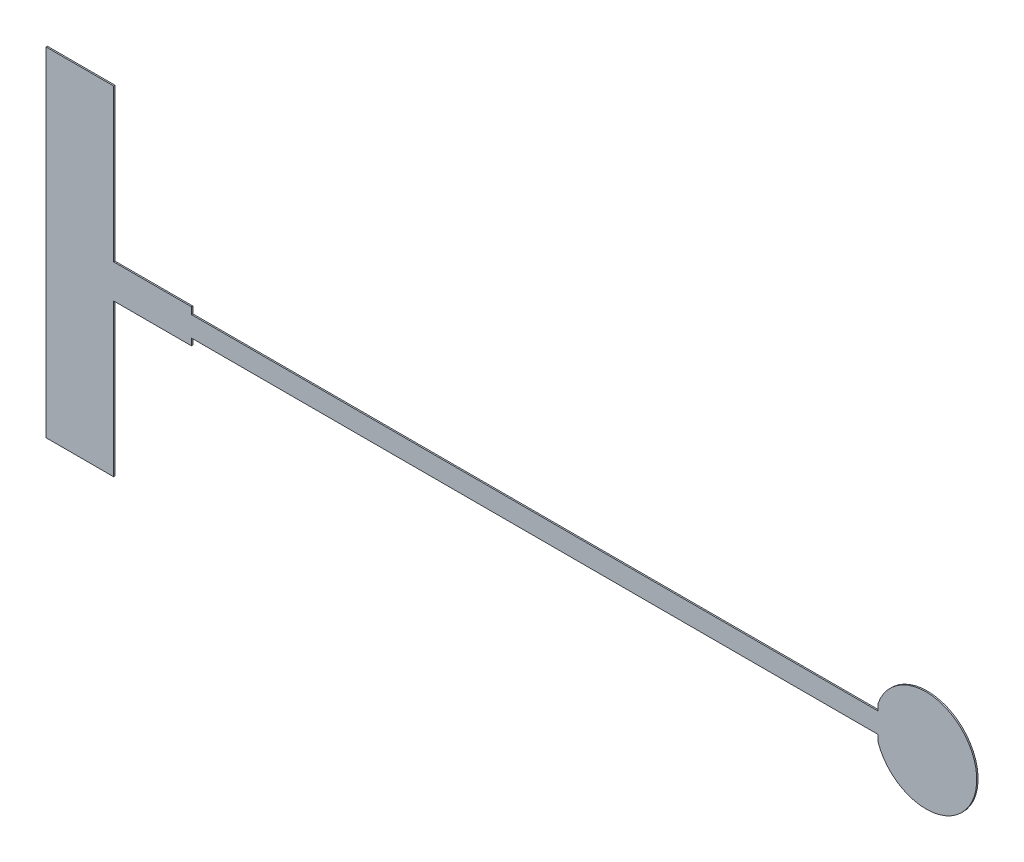
ISO-10303-21;
HEADER;
FILE_DESCRIPTION(('STEP AP214'),'2;1');
FILE_NAME('part.step','',(''),(''),'','','');
FILE_SCHEMA(('AUTOMOTIVE_DESIGN { 1 0 10303 214 1 1 1 1 }'));
ENDSEC;
DATA;
#1=APPLICATION_CONTEXT('core data for automotive mechanical design processes');
#2=APPLICATION_PROTOCOL_DEFINITION('international standard','automotive_design',2000,#1);
#3=PRODUCT_CONTEXT('',#1,'mechanical');
#4=PRODUCT('Part','Part','',(#3));
#5=PRODUCT_RELATED_PRODUCT_CATEGORY('part','',(#4));
#6=PRODUCT_DEFINITION_FORMATION('','',#4);
#7=PRODUCT_DEFINITION_CONTEXT('part definition',#1,'design');
#8=PRODUCT_DEFINITION('design','',#6,#7);
#9=PRODUCT_DEFINITION_SHAPE('','',#8);
#10=(LENGTH_UNIT() NAMED_UNIT(*) SI_UNIT(.MILLI.,.METRE.));
#11=(NAMED_UNIT(*) PLANE_ANGLE_UNIT() SI_UNIT($,.RADIAN.));
#12=(NAMED_UNIT(*) SI_UNIT($,.STERADIAN.) SOLID_ANGLE_UNIT());
#13=UNCERTAINTY_MEASURE_WITH_UNIT(LENGTH_MEASURE(1.E-05),#10,'distance_accuracy_value','');
#14=(GEOMETRIC_REPRESENTATION_CONTEXT(3) GLOBAL_UNCERTAINTY_ASSIGNED_CONTEXT((#13)) GLOBAL_UNIT_ASSIGNED_CONTEXT((#10,
#11,#12)) REPRESENTATION_CONTEXT('',''));
#15=CARTESIAN_POINT('',(0.,0.,0.));
#16=DIRECTION('',(0.,0.,1.));
#17=DIRECTION('',(1.,0.,0.));
#18=AXIS2_PLACEMENT_3D('',#15,#16,#17);
#19=CARTESIAN_POINT('',(1000.,-250.,-20.));
#20=DIRECTION('',(0.,-1.,0.));
#21=DIRECTION('',(1.,0.,0.));
#22=AXIS2_PLACEMENT_3D('',#19,#20,#21);
#23=PLANE('',#22);
#24=DIRECTION('',(1.,0.,0.));
#25=VECTOR('',#24,1.);
#26=CARTESIAN_POINT('',(1000.,-250.,-20.));
#27=LINE('',#26,#25);
#28=CARTESIAN_POINT('',(0.,-250.,-20.));
#29=VERTEX_POINT('',#28);
#30=CARTESIAN_POINT('',(1150.,-250.000000000001,-20.));
#31=VERTEX_POINT('',#30);
#32=EDGE_CURVE('E161',#29,#31,#27,.T.);
#33=ORIENTED_EDGE('',*,*,#32,.T.);
#34=DIRECTION('',(0.,0.,1.));
#35=VECTOR('',#34,1.);
#36=CARTESIAN_POINT('',(1150.,-250.000000000001,-20.));
#37=LINE('',#36,#35);
#38=CARTESIAN_POINT('',(1150.,-250.000000000001,0.));
#39=VERTEX_POINT('',#38);
#40=EDGE_CURVE('E142',#31,#39,#37,.T.);
#41=ORIENTED_EDGE('',*,*,#40,.T.);
#42=DIRECTION('',(1.,0.,0.));
#43=VECTOR('',#42,1.);
#44=CARTESIAN_POINT('',(1000.,-250.,0.));
#45=LINE('',#44,#43);
#46=CARTESIAN_POINT('',(0.,-250.,0.));
#47=VERTEX_POINT('',#46);
#48=EDGE_CURVE('E200',#47,#39,#45,.T.);
#49=ORIENTED_EDGE('',*,*,#48,.F.);
#50=DIRECTION('',(0.,0.,1.));
#51=VECTOR('',#50,1.);
#52=CARTESIAN_POINT('',(0.,-250.,-20.));
#53=LINE('',#52,#51);
#54=EDGE_CURVE('E169',#29,#47,#53,.T.);
#55=ORIENTED_EDGE('',*,*,#54,.F.);
#56=EDGE_LOOP('',(#33,#41,#49,#55));
#57=FACE_BOUND('',#56,.T.);
#58=ADVANCED_FACE('F42',(#57),#23,.T.);
#59=CARTESIAN_POINT('',(12000.,2.44249065417534E-12,-20.));
#60=DIRECTION('',(0.,0.,1.));
#61=DIRECTION('',(1.,0.,0.));
#62=AXIS2_PLACEMENT_3D('',#59,#60,#61);
#63=PLANE('',#62);
#64=DIRECTION('',(0.,1.,0.));
#65=VECTOR('',#64,1.);
#66=CARTESIAN_POINT('',(1150.,-250.000000000001,-20.));
#67=LINE('',#66,#65);
#68=CARTESIAN_POINT('',(1150.,-150.000000000001,-20.));
#69=VERTEX_POINT('',#68);
#70=EDGE_CURVE('E146',#31,#69,#67,.T.);
#71=ORIENTED_EDGE('',*,*,#70,.F.);
#72=ORIENTED_EDGE('',*,*,#32,.F.);
#73=DIRECTION('',(0.,-1.,0.));
#74=VECTOR('',#73,1.);
#75=CARTESIAN_POINT('',(0.,-2500.,-20.));
#76=LINE('',#75,#74);
#77=CARTESIAN_POINT('',(0.,-2500.,-20.));
#78=VERTEX_POINT('',#77);
#79=EDGE_CURVE('E184',#29,#78,#76,.T.);
#80=ORIENTED_EDGE('',*,*,#79,.T.);
#81=DIRECTION('',(1.,0.,0.));
#82=VECTOR('',#81,1.);
#83=CARTESIAN_POINT('',(-1000.,-2500.,-20.));
#84=LINE('',#83,#82);
#85=CARTESIAN_POINT('',(-1000.,-2500.,-20.));
#86=VERTEX_POINT('',#85);
#87=EDGE_CURVE('E196',#86,#78,#84,.T.);
#88=ORIENTED_EDGE('',*,*,#87,.F.);
#89=DIRECTION('',(0.,-1.,0.));
#90=VECTOR('',#89,1.);
#91=CARTESIAN_POINT('',(-1000.,2500.,-20.));
#92=LINE('',#91,#90);
#93=CARTESIAN_POINT('',(-1000.,2500.,-20.));
#94=VERTEX_POINT('',#93);
#95=EDGE_CURVE('E192',#94,#86,#92,.T.);
#96=ORIENTED_EDGE('',*,*,#95,.F.);
#97=DIRECTION('',(-1.,0.,0.));
#98=VECTOR('',#97,1.);
#99=CARTESIAN_POINT('',(-1000.,2500.,-20.));
#100=LINE('',#99,#98);
#101=CARTESIAN_POINT('',(-4.44089209850063E-13,2500.,-20.));
#102=VERTEX_POINT('',#101);
#103=EDGE_CURVE('E189',#102,#94,#100,.T.);
#104=ORIENTED_EDGE('',*,*,#103,.F.);
#105=DIRECTION('',(0.,-1.,0.));
#106=VECTOR('',#105,1.);
#107=CARTESIAN_POINT('',(-4.44089209850063E-13,2500.,-20.));
#108=LINE('',#107,#106);
#109=CARTESIAN_POINT('',(-2.22044604925031E-13,250.,-20.));
#110=VERTEX_POINT('',#109);
#111=EDGE_CURVE('E245',#102,#110,#108,.T.);
#112=ORIENTED_EDGE('',*,*,#111,.T.);
#113=DIRECTION('',(-1.,0.,0.));
#114=VECTOR('',#113,1.);
#115=CARTESIAN_POINT('',(1000.,250.,-20.));
#116=LINE('',#115,#114);
#117=CARTESIAN_POINT('',(1150.,250.000000000001,-20.));
#118=VERTEX_POINT('',#117);
#119=EDGE_CURVE('E178',#118,#110,#116,.T.);
#120=ORIENTED_EDGE('',*,*,#119,.F.);
#121=DIRECTION('',(0.,-1.,0.));
#122=VECTOR('',#121,1.);
#123=CARTESIAN_POINT('',(1150.,250.000000000001,-20.));
#124=LINE('',#123,#122);
#125=CARTESIAN_POINT('',(1150.,150.000000000001,-20.));
#126=VERTEX_POINT('',#125);
#127=EDGE_CURVE('E267',#118,#126,#124,.T.);
#128=ORIENTED_EDGE('',*,*,#127,.T.);
#129=DIRECTION('',(1.,0.,0.));
#130=VECTOR('',#129,1.);
#131=CARTESIAN_POINT('',(1150.,150.000000000001,-20.));
#132=LINE('',#131,#130);
#133=CARTESIAN_POINT('',(11292.8932188135,150.000000000001,-20.));
#134=VERTEX_POINT('',#133);
#135=EDGE_CURVE('E271',#126,#134,#132,.T.);
#136=ORIENTED_EDGE('',*,*,#135,.T.);
#137=DIRECTION('',(0.,1.,0.));
#138=VECTOR('',#137,1.);
#139=CARTESIAN_POINT('',(11292.8932188135,250.000000000001,-20.));
#140=LINE('',#139,#138);
#141=CARTESIAN_POINT('',(11292.8932188135,250.000000000001,-20.));
#142=VERTEX_POINT('',#141);
#143=EDGE_CURVE('E275',#134,#142,#140,.T.);
#144=ORIENTED_EDGE('',*,*,#143,.T.);
#145=CARTESIAN_POINT('',(12000.,2.44249065417534E-12,-20.));
#146=DIRECTION('',(0.,0.,1.));
#147=DIRECTION('',(1.,0.,0.));
#148=AXIS2_PLACEMENT_3D('',#145,#146,#147);
#149=CIRCLE('',#148,749.999999999999);
#150=CARTESIAN_POINT('',(11292.8932188135,-250.,-20.));
#151=VERTEX_POINT('',#150);
#152=EDGE_CURVE('E172',#151,#142,#149,.T.);
#153=ORIENTED_EDGE('',*,*,#152,.F.);
#154=DIRECTION('',(0.,-1.,0.));
#155=VECTOR('',#154,1.);
#156=CARTESIAN_POINT('',(11292.8932188135,-250.000000000001,-20.));
#157=LINE('',#156,#155);
#158=CARTESIAN_POINT('',(11292.8932188135,-150.000000000001,-20.));
#159=VERTEX_POINT('',#158);
#160=EDGE_CURVE('E165',#159,#151,#157,.T.);
#161=ORIENTED_EDGE('',*,*,#160,.F.);
#162=DIRECTION('',(1.,0.,0.));
#163=VECTOR('',#162,1.);
#164=CARTESIAN_POINT('',(1150.,-150.000000000001,-20.));
#165=LINE('',#164,#163);
#166=EDGE_CURVE('E155',#69,#159,#165,.T.);
#167=ORIENTED_EDGE('',*,*,#166,.F.);
#168=EDGE_LOOP('',(#71,#72,#80,#88,#96,#104,#112,#120,#128,#136,#144,#153,#161,#167));
#169=FACE_BOUND('',#168,.T.);
#170=ADVANCED_FACE('F159',(#169),#63,.F.);
#171=CARTESIAN_POINT('',(12000.,2.44249065417534E-12,0.));
#172=DIRECTION('',(0.,0.,1.));
#173=DIRECTION('',(1.,0.,0.));
#174=AXIS2_PLACEMENT_3D('',#171,#172,#173);
#175=PLANE('',#174);
#176=ORIENTED_EDGE('',*,*,#48,.T.);
#177=DIRECTION('',(0.,1.,0.));
#178=VECTOR('',#177,1.);
#179=CARTESIAN_POINT('',(1150.,-250.000000000001,0.));
#180=LINE('',#179,#178);
#181=CARTESIAN_POINT('',(1150.,-150.000000000001,0.));
#182=VERTEX_POINT('',#181);
#183=EDGE_CURVE('E149',#39,#182,#180,.T.);
#184=ORIENTED_EDGE('',*,*,#183,.T.);
#185=DIRECTION('',(1.,0.,0.));
#186=VECTOR('',#185,1.);
#187=CARTESIAN_POINT('',(1150.,-150.000000000001,0.));
#188=LINE('',#187,#186);
#189=CARTESIAN_POINT('',(11292.8932188135,-150.000000000001,0.));
#190=VERTEX_POINT('',#189);
#191=EDGE_CURVE('E166',#182,#190,#188,.T.);
#192=ORIENTED_EDGE('',*,*,#191,.T.);
#193=DIRECTION('',(0.,-1.,0.));
#194=VECTOR('',#193,1.);
#195=CARTESIAN_POINT('',(11292.8932188135,-250.000000000001,0.));
#196=LINE('',#195,#194);
#197=CARTESIAN_POINT('',(11292.8932188135,-250.000000000001,0.));
#198=VERTEX_POINT('',#197);
#199=EDGE_CURVE('E252',#190,#198,#196,.T.);
#200=ORIENTED_EDGE('',*,*,#199,.T.);
#201=CARTESIAN_POINT('',(12000.,2.44249065417534E-12,0.));
#202=DIRECTION('',(0.,0.,1.));
#203=DIRECTION('',(1.,0.,0.));
#204=AXIS2_PLACEMENT_3D('',#201,#202,#203);
#205=CIRCLE('',#204,749.999999999999);
#206=CARTESIAN_POINT('',(11292.8932188135,250.000000000001,0.));
#207=VERTEX_POINT('',#206);
#208=EDGE_CURVE('E203',#198,#207,#205,.T.);
#209=ORIENTED_EDGE('',*,*,#208,.T.);
#210=DIRECTION('',(0.,1.,0.));
#211=VECTOR('',#210,1.);
#212=CARTESIAN_POINT('',(11292.8932188135,250.000000000001,0.));
#213=LINE('',#212,#211);
#214=CARTESIAN_POINT('',(11292.8932188135,150.000000000001,0.));
#215=VERTEX_POINT('',#214);
#216=EDGE_CURVE('E57',#215,#207,#213,.T.);
#217=ORIENTED_EDGE('',*,*,#216,.F.);
#218=DIRECTION('',(1.,0.,0.));
#219=VECTOR('',#218,1.);
#220=CARTESIAN_POINT('',(1150.,150.000000000001,0.));
#221=LINE('',#220,#219);
#222=CARTESIAN_POINT('',(1150.,150.000000000001,0.));
#223=VERTEX_POINT('',#222);
#224=EDGE_CURVE('E283',#223,#215,#221,.T.);
#225=ORIENTED_EDGE('',*,*,#224,.F.);
#226=DIRECTION('',(0.,-1.,0.));
#227=VECTOR('',#226,1.);
#228=CARTESIAN_POINT('',(1150.,250.000000000001,0.));
#229=LINE('',#228,#227);
#230=CARTESIAN_POINT('',(1150.,250.000000000001,0.));
#231=VERTEX_POINT('',#230);
#232=EDGE_CURVE('E264',#231,#223,#229,.T.);
#233=ORIENTED_EDGE('',*,*,#232,.F.);
#234=DIRECTION('',(-1.,0.,0.));
#235=VECTOR('',#234,1.);
#236=CARTESIAN_POINT('',(1000.,250.,0.));
#237=LINE('',#236,#235);
#238=CARTESIAN_POINT('',(-2.22044604925031E-13,250.,0.));
#239=VERTEX_POINT('',#238);
#240=EDGE_CURVE('E208',#231,#239,#237,.T.);
#241=ORIENTED_EDGE('',*,*,#240,.T.);
#242=DIRECTION('',(0.,-1.,0.));
#243=VECTOR('',#242,1.);
#244=CARTESIAN_POINT('',(-4.44089209850063E-13,2500.,0.));
#245=LINE('',#244,#243);
#246=CARTESIAN_POINT('',(0.,2500.,0.));
#247=VERTEX_POINT('',#246);
#248=EDGE_CURVE('E242',#247,#239,#245,.T.);
#249=ORIENTED_EDGE('',*,*,#248,.F.);
#250=DIRECTION('',(-1.,0.,0.));
#251=VECTOR('',#250,1.);
#252=CARTESIAN_POINT('',(-1000.,2500.,0.));
#253=LINE('',#252,#251);
#254=CARTESIAN_POINT('',(-1000.,2500.,0.));
#255=VERTEX_POINT('',#254);
#256=EDGE_CURVE('E211',#247,#255,#253,.T.);
#257=ORIENTED_EDGE('',*,*,#256,.T.);
#258=DIRECTION('',(0.,-1.,0.));
#259=VECTOR('',#258,1.);
#260=CARTESIAN_POINT('',(-1000.,2500.,0.));
#261=LINE('',#260,#259);
#262=CARTESIAN_POINT('',(-1000.,-2500.,0.));
#263=VERTEX_POINT('',#262);
#264=EDGE_CURVE('E181',#255,#263,#261,.T.);
#265=ORIENTED_EDGE('',*,*,#264,.T.);
#266=DIRECTION('',(1.,0.,0.));
#267=VECTOR('',#266,1.);
#268=CARTESIAN_POINT('',(-1000.,-2500.,0.));
#269=LINE('',#268,#267);
#270=CARTESIAN_POINT('',(0.,-2500.,0.));
#271=VERTEX_POINT('',#270);
#272=EDGE_CURVE('E173',#263,#271,#269,.T.);
#273=ORIENTED_EDGE('',*,*,#272,.T.);
#274=DIRECTION('',(0.,-1.,0.));
#275=VECTOR('',#274,1.);
#276=CARTESIAN_POINT('',(0.,-2500.,0.));
#277=LINE('',#276,#275);
#278=EDGE_CURVE('E240',#47,#271,#277,.T.);
#279=ORIENTED_EDGE('',*,*,#278,.F.);
#280=EDGE_LOOP('',(#176,#184,#192,#200,#209,#217,#225,#233,#241,#249,#257,#265,#273,#279));
#281=FACE_BOUND('',#280,.T.);
#282=ADVANCED_FACE('F219',(#281),#175,.T.);
#283=CARTESIAN_POINT('',(-1000.,-2500.,-20.));
#284=DIRECTION('',(0.,-1.,0.));
#285=DIRECTION('',(0.,0.,-1.));
#286=AXIS2_PLACEMENT_3D('',#283,#284,#285);
#287=PLANE('',#286);
#288=DIRECTION('',(0.,0.,1.));
#289=VECTOR('',#288,1.);
#290=CARTESIAN_POINT('',(0.,-2500.,-20.));
#291=LINE('',#290,#289);
#292=EDGE_CURVE('E228',#78,#271,#291,.T.);
#293=ORIENTED_EDGE('',*,*,#292,.T.);
#294=ORIENTED_EDGE('',*,*,#272,.F.);
#295=DIRECTION('',(0.,0.,1.));
#296=VECTOR('',#295,1.);
#297=CARTESIAN_POINT('',(-1000.,-2500.,-20.));
#298=LINE('',#297,#296);
#299=EDGE_CURVE('E11',#86,#263,#298,.T.);
#300=ORIENTED_EDGE('',*,*,#299,.F.);
#301=ORIENTED_EDGE('',*,*,#87,.T.);
#302=EDGE_LOOP('',(#293,#294,#300,#301));
#303=FACE_BOUND('',#302,.T.);
#304=ADVANCED_FACE('F227',(#303),#287,.T.);
#305=CARTESIAN_POINT('',(-1000.,2500.,-20.));
#306=DIRECTION('',(-1.,0.,0.));
#307=DIRECTION('',(0.,-1.,0.));
#308=AXIS2_PLACEMENT_3D('',#305,#306,#307);
#309=PLANE('',#308);
#310=ORIENTED_EDGE('',*,*,#264,.F.);
#311=DIRECTION('',(0.,0.,1.));
#312=VECTOR('',#311,1.);
#313=CARTESIAN_POINT('',(-1000.,2500.,-20.));
#314=LINE('',#313,#312);
#315=EDGE_CURVE('E45',#94,#255,#314,.T.);
#316=ORIENTED_EDGE('',*,*,#315,.F.);
#317=ORIENTED_EDGE('',*,*,#95,.T.);
#318=ORIENTED_EDGE('',*,*,#299,.T.);
#319=EDGE_LOOP('',(#310,#316,#317,#318));
#320=FACE_BOUND('',#319,.T.);
#321=ADVANCED_FACE('F317',(#320),#309,.T.);
#322=CARTESIAN_POINT('',(-1000.,2500.,-20.));
#323=DIRECTION('',(0.,1.,0.));
#324=DIRECTION('',(0.,0.,1.));
#325=AXIS2_PLACEMENT_3D('',#322,#323,#324);
#326=PLANE('',#325);
#327=DIRECTION('',(0.,0.,1.));
#328=VECTOR('',#327,1.);
#329=CARTESIAN_POINT('',(-4.44089209850063E-13,2500.,-20.));
#330=LINE('',#329,#328);
#331=EDGE_CURVE('E65',#102,#247,#330,.T.);
#332=ORIENTED_EDGE('',*,*,#331,.F.);
#333=ORIENTED_EDGE('',*,*,#103,.T.);
#334=ORIENTED_EDGE('',*,*,#315,.T.);
#335=ORIENTED_EDGE('',*,*,#256,.F.);
#336=EDGE_LOOP('',(#332,#333,#334,#335));
#337=FACE_BOUND('',#336,.T.);
#338=ADVANCED_FACE('F314',(#337),#326,.T.);
#339=CARTESIAN_POINT('',(1000.,250.,-20.));
#340=DIRECTION('',(0.,1.,0.));
#341=DIRECTION('',(0.,0.,1.));
#342=AXIS2_PLACEMENT_3D('',#339,#340,#341);
#343=PLANE('',#342);
#344=DIRECTION('',(0.,0.,1.));
#345=VECTOR('',#344,1.);
#346=CARTESIAN_POINT('',(1150.,250.000000000001,-20.));
#347=LINE('',#346,#345);
#348=EDGE_CURVE('E289',#118,#231,#347,.T.);
#349=ORIENTED_EDGE('',*,*,#348,.F.);
#350=ORIENTED_EDGE('',*,*,#119,.T.);
#351=DIRECTION('',(0.,0.,1.));
#352=VECTOR('',#351,1.);
#353=CARTESIAN_POINT('',(-2.22044604925031E-13,250.,-20.));
#354=LINE('',#353,#352);
#355=EDGE_CURVE('E204',#110,#239,#354,.T.);
#356=ORIENTED_EDGE('',*,*,#355,.T.);
#357=ORIENTED_EDGE('',*,*,#240,.F.);
#358=EDGE_LOOP('',(#349,#350,#356,#357));
#359=FACE_BOUND('',#358,.T.);
#360=ADVANCED_FACE('F309',(#359),#343,.T.);
#361=CARTESIAN_POINT('',(12000.,2.44249065417534E-12,-20.));
#362=DIRECTION('',(0.,0.,1.));
#363=DIRECTION('',(1.,0.,0.));
#364=AXIS2_PLACEMENT_3D('',#361,#362,#363);
#365=CYLINDRICAL_SURFACE('',#364,749.999999999999);
#366=DIRECTION('',(0.,0.,1.));
#367=VECTOR('',#366,1.);
#368=CARTESIAN_POINT('',(11292.8932188135,250.,-20.));
#369=LINE('',#368,#367);
#370=EDGE_CURVE('E237',#207,#142,#369,.F.);
#371=ORIENTED_EDGE('',*,*,#370,.F.);
#372=ORIENTED_EDGE('',*,*,#208,.F.);
#373=DIRECTION('',(0.,0.,1.));
#374=VECTOR('',#373,1.);
#375=CARTESIAN_POINT('',(11292.8932188135,-250.,-20.));
#376=LINE('',#375,#374);
#377=EDGE_CURVE('E232',#151,#198,#376,.T.);
#378=ORIENTED_EDGE('',*,*,#377,.F.);
#379=ORIENTED_EDGE('',*,*,#152,.T.);
#380=EDGE_LOOP('',(#371,#372,#378,#379));
#381=FACE_BOUND('',#380,.T.);
#382=ADVANCED_FACE('F329',(#381),#365,.T.);
#383=CARTESIAN_POINT('',(0.,-2500.,-20.));
#384=DIRECTION('',(-1.,0.,0.));
#385=DIRECTION('',(0.,0.,1.));
#386=AXIS2_PLACEMENT_3D('',#383,#384,#385);
#387=PLANE('',#386);
#388=ORIENTED_EDGE('',*,*,#278,.T.);
#389=ORIENTED_EDGE('',*,*,#292,.F.);
#390=ORIENTED_EDGE('',*,*,#79,.F.);
#391=ORIENTED_EDGE('',*,*,#54,.T.);
#392=EDGE_LOOP('',(#388,#389,#390,#391));
#393=FACE_BOUND('',#392,.T.);
#394=ADVANCED_FACE('F248',(#393),#387,.F.);
#395=CARTESIAN_POINT('',(-4.44089209850063E-13,2500.,-20.));
#396=DIRECTION('',(-1.,0.,0.));
#397=DIRECTION('',(0.,-1.,0.));
#398=AXIS2_PLACEMENT_3D('',#395,#396,#397);
#399=PLANE('',#398);
#400=ORIENTED_EDGE('',*,*,#248,.T.);
#401=ORIENTED_EDGE('',*,*,#355,.F.);
#402=ORIENTED_EDGE('',*,*,#111,.F.);
#403=ORIENTED_EDGE('',*,*,#331,.T.);
#404=EDGE_LOOP('',(#400,#401,#402,#403));
#405=FACE_BOUND('',#404,.T.);
#406=ADVANCED_FACE('F311',(#405),#399,.F.);
#407=CARTESIAN_POINT('',(1150.,250.000000000001,-20.));
#408=DIRECTION('',(-1.,0.,0.));
#409=DIRECTION('',(0.,-1.,0.));
#410=AXIS2_PLACEMENT_3D('',#407,#408,#409);
#411=PLANE('',#410);
#412=ORIENTED_EDGE('',*,*,#232,.T.);
#413=DIRECTION('',(0.,0.,1.));
#414=VECTOR('',#413,1.);
#415=CARTESIAN_POINT('',(1150.,150.000000000001,-20.));
#416=LINE('',#415,#414);
#417=EDGE_CURVE('E279',#126,#223,#416,.T.);
#418=ORIENTED_EDGE('',*,*,#417,.F.);
#419=ORIENTED_EDGE('',*,*,#127,.F.);
#420=ORIENTED_EDGE('',*,*,#348,.T.);
#421=EDGE_LOOP('',(#412,#418,#419,#420));
#422=FACE_BOUND('',#421,.T.);
#423=ADVANCED_FACE('F320',(#422),#411,.F.);
#424=CARTESIAN_POINT('',(11292.8932188135,250.000000000001,-20.));
#425=DIRECTION('',(1.,0.,0.));
#426=DIRECTION('',(0.,0.,-1.));
#427=AXIS2_PLACEMENT_3D('',#424,#425,#426);
#428=PLANE('',#427);
#429=ORIENTED_EDGE('',*,*,#216,.T.);
#430=ORIENTED_EDGE('',*,*,#370,.T.);
#431=ORIENTED_EDGE('',*,*,#143,.F.);
#432=DIRECTION('',(0.,0.,1.));
#433=VECTOR('',#432,1.);
#434=CARTESIAN_POINT('',(11292.8932188135,150.000000000001,-20.));
#435=LINE('',#434,#433);
#436=EDGE_CURVE('E292',#134,#215,#435,.T.);
#437=ORIENTED_EDGE('',*,*,#436,.T.);
#438=EDGE_LOOP('',(#429,#430,#431,#437));
#439=FACE_BOUND('',#438,.T.);
#440=ADVANCED_FACE('F325',(#439),#428,.F.);
#441=CARTESIAN_POINT('',(1150.,150.000000000001,-20.));
#442=DIRECTION('',(0.,-1.,0.));
#443=DIRECTION('',(0.,0.,-1.));
#444=AXIS2_PLACEMENT_3D('',#441,#442,#443);
#445=PLANE('',#444);
#446=ORIENTED_EDGE('',*,*,#224,.T.);
#447=ORIENTED_EDGE('',*,*,#436,.F.);
#448=ORIENTED_EDGE('',*,*,#135,.F.);
#449=ORIENTED_EDGE('',*,*,#417,.T.);
#450=EDGE_LOOP('',(#446,#447,#448,#449));
#451=FACE_BOUND('',#450,.T.);
#452=ADVANCED_FACE('F323',(#451),#445,.F.);
#453=CARTESIAN_POINT('',(1150.,-250.000000000001,-20.));
#454=DIRECTION('',(1.,0.,0.));
#455=DIRECTION('',(0.,1.,0.));
#456=AXIS2_PLACEMENT_3D('',#453,#454,#455);
#457=PLANE('',#456);
#458=ORIENTED_EDGE('',*,*,#183,.F.);
#459=ORIENTED_EDGE('',*,*,#40,.F.);
#460=ORIENTED_EDGE('',*,*,#70,.T.);
#461=DIRECTION('',(0.,0.,1.));
#462=VECTOR('',#461,1.);
#463=CARTESIAN_POINT('',(1150.,-150.000000000001,-20.));
#464=LINE('',#463,#462);
#465=EDGE_CURVE('E261',#69,#182,#464,.T.);
#466=ORIENTED_EDGE('',*,*,#465,.T.);
#467=EDGE_LOOP('',(#458,#459,#460,#466));
#468=FACE_BOUND('',#467,.T.);
#469=ADVANCED_FACE('F144',(#468),#457,.T.);
#470=CARTESIAN_POINT('',(1150.,-150.000000000001,-20.));
#471=DIRECTION('',(0.,-1.,0.));
#472=DIRECTION('',(0.,0.,-1.));
#473=AXIS2_PLACEMENT_3D('',#470,#471,#472);
#474=PLANE('',#473);
#475=ORIENTED_EDGE('',*,*,#191,.F.);
#476=ORIENTED_EDGE('',*,*,#465,.F.);
#477=ORIENTED_EDGE('',*,*,#166,.T.);
#478=DIRECTION('',(0.,0.,1.));
#479=VECTOR('',#478,1.);
#480=CARTESIAN_POINT('',(11292.8932188135,-150.000000000001,-20.));
#481=LINE('',#480,#479);
#482=EDGE_CURVE('E154',#159,#190,#481,.T.);
#483=ORIENTED_EDGE('',*,*,#482,.T.);
#484=EDGE_LOOP('',(#475,#476,#477,#483));
#485=FACE_BOUND('',#484,.T.);
#486=ADVANCED_FACE('F338',(#485),#474,.T.);
#487=CARTESIAN_POINT('',(11292.8932188135,-250.000000000001,-20.));
#488=DIRECTION('',(-1.,0.,0.));
#489=DIRECTION('',(0.,0.,1.));
#490=AXIS2_PLACEMENT_3D('',#487,#488,#489);
#491=PLANE('',#490);
#492=ORIENTED_EDGE('',*,*,#199,.F.);
#493=ORIENTED_EDGE('',*,*,#482,.F.);
#494=ORIENTED_EDGE('',*,*,#160,.T.);
#495=ORIENTED_EDGE('',*,*,#377,.T.);
#496=EDGE_LOOP('',(#492,#493,#494,#495));
#497=FACE_BOUND('',#496,.T.);
#498=ADVANCED_FACE('F333',(#497),#491,.T.);
#499=CLOSED_SHELL('',(#58,#170,#282,#304,#321,#338,#360,#382,#394,#406,#423,#440,#452,#469,#486,#498));
#500=MANIFOLD_SOLID_BREP('B2',#499);
#501=ADVANCED_BREP_SHAPE_REPRESENTATION('',(#18,#500),#14);
#502=SHAPE_DEFINITION_REPRESENTATION(#9,#501);
ENDSEC;
END-ISO-10303-21;
